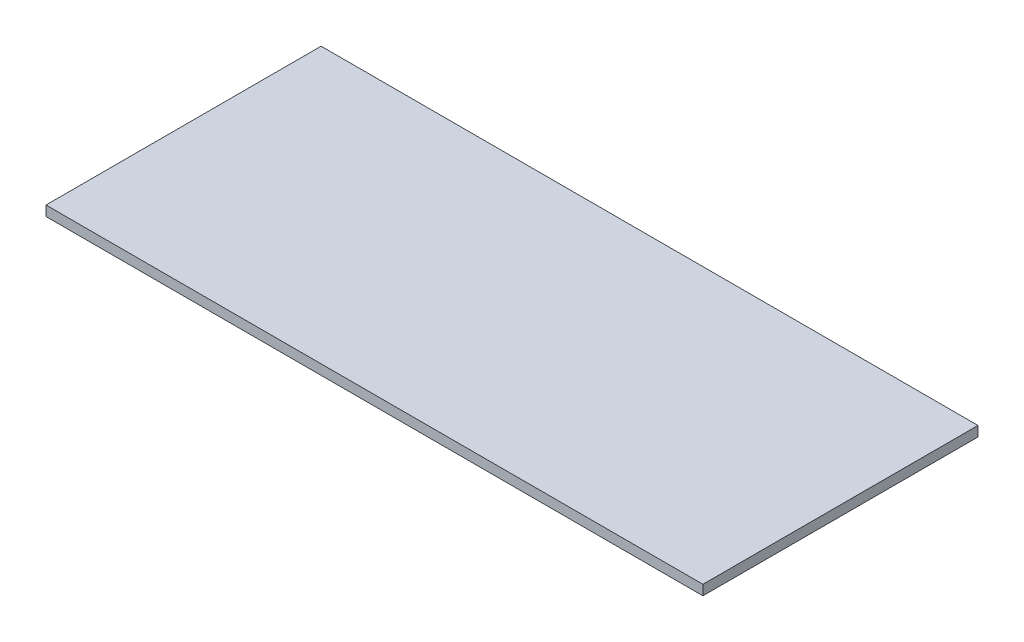
ISO-10303-21;
HEADER;
FILE_DESCRIPTION(('STEP AP214'),'2;1');
FILE_NAME('part.step','',(''),(''),'','','');
FILE_SCHEMA(('AUTOMOTIVE_DESIGN { 1 0 10303 214 1 1 1 1 }'));
ENDSEC;
DATA;
#1=APPLICATION_CONTEXT('core data for automotive mechanical design processes');
#2=APPLICATION_PROTOCOL_DEFINITION('international standard','automotive_design',2000,#1);
#3=PRODUCT_CONTEXT('',#1,'mechanical');
#4=PRODUCT('Part','Part','',(#3));
#5=PRODUCT_RELATED_PRODUCT_CATEGORY('part','',(#4));
#6=PRODUCT_DEFINITION_FORMATION('','',#4);
#7=PRODUCT_DEFINITION_CONTEXT('part definition',#1,'design');
#8=PRODUCT_DEFINITION('design','',#6,#7);
#9=PRODUCT_DEFINITION_SHAPE('','',#8);
#10=(LENGTH_UNIT() NAMED_UNIT(*) SI_UNIT(.MILLI.,.METRE.));
#11=(NAMED_UNIT(*) PLANE_ANGLE_UNIT() SI_UNIT($,.RADIAN.));
#12=(NAMED_UNIT(*) SI_UNIT($,.STERADIAN.) SOLID_ANGLE_UNIT());
#13=UNCERTAINTY_MEASURE_WITH_UNIT(LENGTH_MEASURE(1.E-05),#10,'distance_accuracy_value','');
#14=(GEOMETRIC_REPRESENTATION_CONTEXT(3) GLOBAL_UNCERTAINTY_ASSIGNED_CONTEXT((#13)) GLOBAL_UNIT_ASSIGNED_CONTEXT((#10,
#11,#12)) REPRESENTATION_CONTEXT('',''));
#15=CARTESIAN_POINT('',(0.,0.,0.));
#16=DIRECTION('',(0.,0.,1.));
#17=DIRECTION('',(1.,0.,0.));
#18=AXIS2_PLACEMENT_3D('',#15,#16,#17);
#19=CARTESIAN_POINT('',(103.,6.,-166.999999999998));
#20=DIRECTION('',(1.,0.,0.));
#21=DIRECTION('',(0.,0.,-1.));
#22=AXIS2_PLACEMENT_3D('',#19,#20,#21);
#23=PLANE('',#22);
#24=DIRECTION('',(0.,0.,1.));
#25=VECTOR('',#24,1.);
#26=CARTESIAN_POINT('',(103.,0.,-166.999999999998));
#27=LINE('',#26,#25);
#28=CARTESIAN_POINT('',(103.,0.,-166.999999999998));
#29=VERTEX_POINT('',#28);
#30=CARTESIAN_POINT('',(103.,0.,-1.99999999999817));
#31=VERTEX_POINT('',#30);
#32=EDGE_CURVE('E96',#29,#31,#27,.T.);
#33=ORIENTED_EDGE('',*,*,#32,.T.);
#34=DIRECTION('',(0.,-1.,0.));
#35=VECTOR('',#34,1.);
#36=CARTESIAN_POINT('',(103.,6.,-1.99999999999817));
#37=LINE('',#36,#35);
#38=CARTESIAN_POINT('',(103.,6.,-1.99999999999817));
#39=VERTEX_POINT('',#38);
#40=EDGE_CURVE('E11',#39,#31,#37,.T.);
#41=ORIENTED_EDGE('',*,*,#40,.F.);
#42=DIRECTION('',(0.,0.,1.));
#43=VECTOR('',#42,1.);
#44=CARTESIAN_POINT('',(103.,6.,-166.999999999998));
#45=LINE('',#44,#43);
#46=CARTESIAN_POINT('',(103.,6.,-166.999999999998));
#47=VERTEX_POINT('',#46);
#48=EDGE_CURVE('E84',#47,#39,#45,.T.);
#49=ORIENTED_EDGE('',*,*,#48,.F.);
#50=DIRECTION('',(0.,-1.,0.));
#51=VECTOR('',#50,1.);
#52=CARTESIAN_POINT('',(103.,6.,-166.999999999998));
#53=LINE('',#52,#51);
#54=EDGE_CURVE('E92',#47,#29,#53,.T.);
#55=ORIENTED_EDGE('',*,*,#54,.T.);
#56=EDGE_LOOP('',(#33,#41,#49,#55));
#57=FACE_BOUND('',#56,.T.);
#58=ADVANCED_FACE('F33',(#57),#23,.F.);
#59=CARTESIAN_POINT('',(103.,6.,-1.99999999999817));
#60=DIRECTION('',(0.,0.,-1.));
#61=DIRECTION('',(-1.,0.,0.));
#62=AXIS2_PLACEMENT_3D('',#59,#60,#61);
#63=PLANE('',#62);
#64=DIRECTION('',(1.,0.,0.));
#65=VECTOR('',#64,1.);
#66=CARTESIAN_POINT('',(103.,0.,-1.99999999999817));
#67=LINE('',#66,#65);
#68=CARTESIAN_POINT('',(497.,0.,-1.99999999999817));
#69=VERTEX_POINT('',#68);
#70=EDGE_CURVE('E88',#31,#69,#67,.T.);
#71=ORIENTED_EDGE('',*,*,#70,.T.);
#72=DIRECTION('',(0.,-1.,0.));
#73=VECTOR('',#72,1.);
#74=CARTESIAN_POINT('',(497.,6.,-1.99999999999817));
#75=LINE('',#74,#73);
#76=CARTESIAN_POINT('',(497.,6.,-1.99999999999817));
#77=VERTEX_POINT('',#76);
#78=EDGE_CURVE('E41',#77,#69,#75,.T.);
#79=ORIENTED_EDGE('',*,*,#78,.F.);
#80=DIRECTION('',(1.,0.,0.));
#81=VECTOR('',#80,1.);
#82=CARTESIAN_POINT('',(103.,6.,-1.99999999999817));
#83=LINE('',#82,#81);
#84=EDGE_CURVE('E79',#39,#77,#83,.T.);
#85=ORIENTED_EDGE('',*,*,#84,.F.);
#86=ORIENTED_EDGE('',*,*,#40,.T.);
#87=EDGE_LOOP('',(#71,#79,#85,#86));
#88=FACE_BOUND('',#87,.T.);
#89=ADVANCED_FACE('F87',(#88),#63,.F.);
#90=CARTESIAN_POINT('',(497.,6.,-166.999999999998));
#91=DIRECTION('',(-1.,0.,0.));
#92=DIRECTION('',(0.,0.,1.));
#93=AXIS2_PLACEMENT_3D('',#90,#91,#92);
#94=PLANE('',#93);
#95=DIRECTION('',(0.,0.,-1.));
#96=VECTOR('',#95,1.);
#97=CARTESIAN_POINT('',(497.,0.,-166.999999999998));
#98=LINE('',#97,#96);
#99=CARTESIAN_POINT('',(497.,0.,-166.999999999998));
#100=VERTEX_POINT('',#99);
#101=EDGE_CURVE('E66',#69,#100,#98,.T.);
#102=ORIENTED_EDGE('',*,*,#101,.T.);
#103=DIRECTION('',(0.,-1.,0.));
#104=VECTOR('',#103,1.);
#105=CARTESIAN_POINT('',(497.,6.,-166.999999999998));
#106=LINE('',#105,#104);
#107=CARTESIAN_POINT('',(497.,6.,-166.999999999998));
#108=VERTEX_POINT('',#107);
#109=EDGE_CURVE('E89',#108,#100,#106,.T.);
#110=ORIENTED_EDGE('',*,*,#109,.F.);
#111=DIRECTION('',(0.,0.,-1.));
#112=VECTOR('',#111,1.);
#113=CARTESIAN_POINT('',(497.,6.,-166.999999999998));
#114=LINE('',#113,#112);
#115=EDGE_CURVE('E82',#77,#108,#114,.T.);
#116=ORIENTED_EDGE('',*,*,#115,.F.);
#117=ORIENTED_EDGE('',*,*,#78,.T.);
#118=EDGE_LOOP('',(#102,#110,#116,#117));
#119=FACE_BOUND('',#118,.T.);
#120=ADVANCED_FACE('F90',(#119),#94,.F.);
#121=CARTESIAN_POINT('',(103.,6.,-166.999999999998));
#122=DIRECTION('',(0.,0.,1.));
#123=DIRECTION('',(1.,0.,0.));
#124=AXIS2_PLACEMENT_3D('',#121,#122,#123);
#125=PLANE('',#124);
#126=DIRECTION('',(-1.,0.,0.));
#127=VECTOR('',#126,1.);
#128=CARTESIAN_POINT('',(103.,0.,-166.999999999998));
#129=LINE('',#128,#127);
#130=EDGE_CURVE('E72',#100,#29,#129,.T.);
#131=ORIENTED_EDGE('',*,*,#130,.T.);
#132=ORIENTED_EDGE('',*,*,#54,.F.);
#133=DIRECTION('',(-1.,0.,0.));
#134=VECTOR('',#133,1.);
#135=CARTESIAN_POINT('',(103.,6.,-166.999999999998));
#136=LINE('',#135,#134);
#137=EDGE_CURVE('E49',#108,#47,#136,.T.);
#138=ORIENTED_EDGE('',*,*,#137,.F.);
#139=ORIENTED_EDGE('',*,*,#109,.T.);
#140=EDGE_LOOP('',(#131,#132,#138,#139));
#141=FACE_BOUND('',#140,.T.);
#142=ADVANCED_FACE('F103',(#141),#125,.F.);
#143=CARTESIAN_POINT('',(0.,6.,0.));
#144=DIRECTION('',(0.,1.,0.));
#145=DIRECTION('',(0.,0.,1.));
#146=AXIS2_PLACEMENT_3D('',#143,#144,#145);
#147=PLANE('',#146);
#148=ORIENTED_EDGE('',*,*,#48,.T.);
#149=ORIENTED_EDGE('',*,*,#84,.T.);
#150=ORIENTED_EDGE('',*,*,#115,.T.);
#151=ORIENTED_EDGE('',*,*,#137,.T.);
#152=EDGE_LOOP('',(#148,#149,#150,#151));
#153=FACE_BOUND('',#152,.T.);
#154=ADVANCED_FACE('F80',(#153),#147,.T.);
#155=CARTESIAN_POINT('',(0.,0.,0.));
#156=DIRECTION('',(0.,1.,0.));
#157=DIRECTION('',(0.,0.,1.));
#158=AXIS2_PLACEMENT_3D('',#155,#156,#157);
#159=PLANE('',#158);
#160=ORIENTED_EDGE('',*,*,#32,.F.);
#161=ORIENTED_EDGE('',*,*,#130,.F.);
#162=ORIENTED_EDGE('',*,*,#101,.F.);
#163=ORIENTED_EDGE('',*,*,#70,.F.);
#164=EDGE_LOOP('',(#160,#161,#162,#163));
#165=FACE_BOUND('',#164,.T.);
#166=ADVANCED_FACE('F106',(#165),#159,.F.);
#167=CLOSED_SHELL('',(#58,#89,#120,#142,#154,#166));
#168=MANIFOLD_SOLID_BREP('B2',#167);
#169=ADVANCED_BREP_SHAPE_REPRESENTATION('',(#18,#168),#14);
#170=SHAPE_DEFINITION_REPRESENTATION(#9,#169);
ENDSEC;
END-ISO-10303-21;
